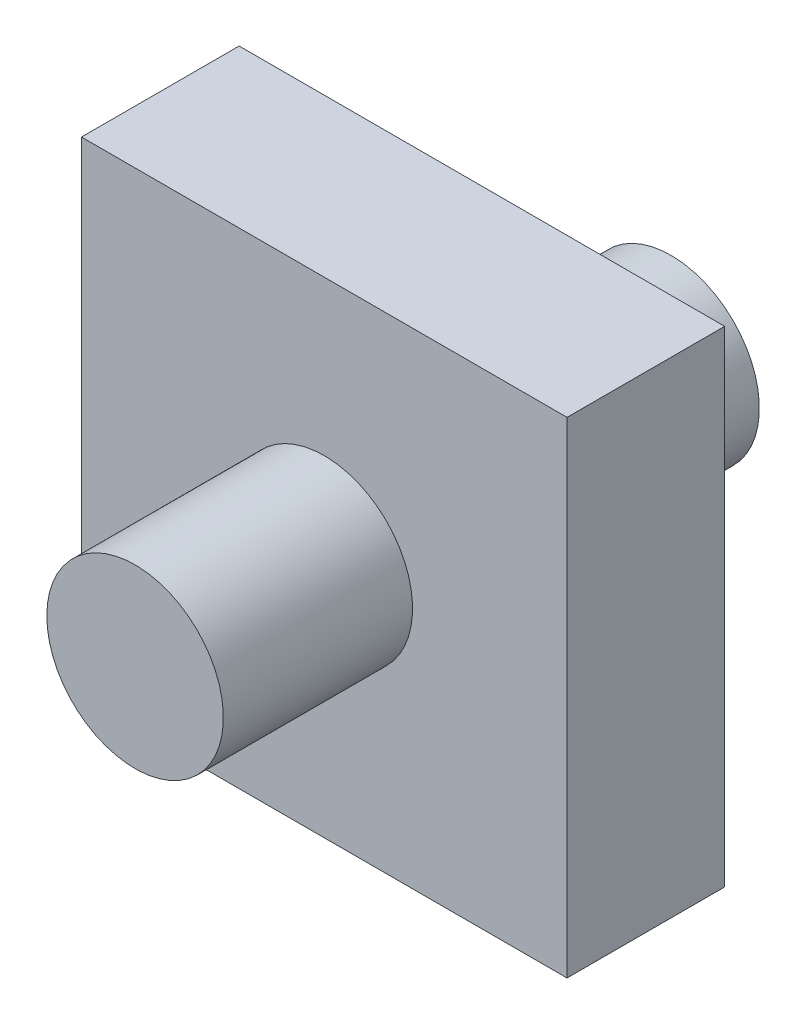
ISO-10303-21;
HEADER;
FILE_DESCRIPTION(('STEP AP214'),'2;1');
FILE_NAME('part.step','',(''),(''),'','','');
FILE_SCHEMA(('AUTOMOTIVE_DESIGN { 1 0 10303 214 1 1 1 1 }'));
ENDSEC;
DATA;
#1=APPLICATION_CONTEXT('core data for automotive mechanical design processes');
#2=APPLICATION_PROTOCOL_DEFINITION('international standard','automotive_design',2000,#1);
#3=PRODUCT_CONTEXT('',#1,'mechanical');
#4=PRODUCT('Part','Part','',(#3));
#5=PRODUCT_RELATED_PRODUCT_CATEGORY('part','',(#4));
#6=PRODUCT_DEFINITION_FORMATION('','',#4);
#7=PRODUCT_DEFINITION_CONTEXT('part definition',#1,'design');
#8=PRODUCT_DEFINITION('design','',#6,#7);
#9=PRODUCT_DEFINITION_SHAPE('','',#8);
#10=(LENGTH_UNIT() NAMED_UNIT(*) SI_UNIT(.MILLI.,.METRE.));
#11=(NAMED_UNIT(*) PLANE_ANGLE_UNIT() SI_UNIT($,.RADIAN.));
#12=(NAMED_UNIT(*) SI_UNIT($,.STERADIAN.) SOLID_ANGLE_UNIT());
#13=UNCERTAINTY_MEASURE_WITH_UNIT(LENGTH_MEASURE(1.E-05),#10,'distance_accuracy_value','');
#14=(GEOMETRIC_REPRESENTATION_CONTEXT(3) GLOBAL_UNCERTAINTY_ASSIGNED_CONTEXT((#13)) GLOBAL_UNIT_ASSIGNED_CONTEXT((#10,
#11,#12)) REPRESENTATION_CONTEXT('',''));
#15=CARTESIAN_POINT('',(0.,0.,0.));
#16=DIRECTION('',(0.,0.,1.));
#17=DIRECTION('',(1.,0.,0.));
#18=AXIS2_PLACEMENT_3D('',#15,#16,#17);
#19=CARTESIAN_POINT('',(3.85,-3.85,2.5));
#20=DIRECTION('',(-1.,0.,0.));
#21=DIRECTION('',(0.,-1.,0.));
#22=AXIS2_PLACEMENT_3D('',#19,#20,#21);
#23=PLANE('',#22);
#24=DIRECTION('',(0.,1.,0.));
#25=VECTOR('',#24,1.);
#26=CARTESIAN_POINT('',(3.85,-3.85,0.));
#27=LINE('',#26,#25);
#28=CARTESIAN_POINT('',(3.85,-3.85,0.));
#29=VERTEX_POINT('',#28);
#30=CARTESIAN_POINT('',(3.85,3.85,0.));
#31=VERTEX_POINT('',#30);
#32=EDGE_CURVE('E99',#29,#31,#27,.T.);
#33=ORIENTED_EDGE('',*,*,#32,.T.);
#34=DIRECTION('',(0.,0.,-1.));
#35=VECTOR('',#34,1.);
#36=CARTESIAN_POINT('',(3.85,3.85,2.5));
#37=LINE('',#36,#35);
#38=CARTESIAN_POINT('',(3.85,3.85,2.5));
#39=VERTEX_POINT('',#38);
#40=EDGE_CURVE('E36',#39,#31,#37,.T.);
#41=ORIENTED_EDGE('',*,*,#40,.F.);
#42=DIRECTION('',(0.,1.,0.));
#43=VECTOR('',#42,1.);
#44=CARTESIAN_POINT('',(3.85,-3.85,2.5));
#45=LINE('',#44,#43);
#46=CARTESIAN_POINT('',(3.85,-3.85,2.5));
#47=VERTEX_POINT('',#46);
#48=EDGE_CURVE('E86',#47,#39,#45,.T.);
#49=ORIENTED_EDGE('',*,*,#48,.F.);
#50=DIRECTION('',(0.,0.,-1.));
#51=VECTOR('',#50,1.);
#52=CARTESIAN_POINT('',(3.85,-3.85,2.5));
#53=LINE('',#52,#51);
#54=EDGE_CURVE('E95',#47,#29,#53,.T.);
#55=ORIENTED_EDGE('',*,*,#54,.T.);
#56=EDGE_LOOP('',(#33,#41,#49,#55));
#57=FACE_BOUND('',#56,.T.);
#58=ADVANCED_FACE('F33',(#57),#23,.F.);
#59=CARTESIAN_POINT('',(-3.85,3.85,2.5));
#60=DIRECTION('',(0.,-1.,0.));
#61=DIRECTION('',(0.,0.,-1.));
#62=AXIS2_PLACEMENT_3D('',#59,#60,#61);
#63=PLANE('',#62);
#64=DIRECTION('',(-1.,0.,0.));
#65=VECTOR('',#64,1.);
#66=CARTESIAN_POINT('',(-3.85,3.85,0.));
#67=LINE('',#66,#65);
#68=CARTESIAN_POINT('',(-3.85,3.85,0.));
#69=VERTEX_POINT('',#68);
#70=EDGE_CURVE('E91',#31,#69,#67,.T.);
#71=ORIENTED_EDGE('',*,*,#70,.T.);
#72=DIRECTION('',(0.,0.,-1.));
#73=VECTOR('',#72,1.);
#74=CARTESIAN_POINT('',(-3.85,3.85,2.5));
#75=LINE('',#74,#73);
#76=CARTESIAN_POINT('',(-3.85,3.85,2.5));
#77=VERTEX_POINT('',#76);
#78=EDGE_CURVE('E89',#77,#69,#75,.T.);
#79=ORIENTED_EDGE('',*,*,#78,.F.);
#80=DIRECTION('',(-1.,0.,0.));
#81=VECTOR('',#80,1.);
#82=CARTESIAN_POINT('',(-3.85,3.85,2.5));
#83=LINE('',#82,#81);
#84=EDGE_CURVE('E81',#39,#77,#83,.T.);
#85=ORIENTED_EDGE('',*,*,#84,.F.);
#86=ORIENTED_EDGE('',*,*,#40,.T.);
#87=EDGE_LOOP('',(#71,#79,#85,#86));
#88=FACE_BOUND('',#87,.T.);
#89=ADVANCED_FACE('F90',(#88),#63,.F.);
#90=CARTESIAN_POINT('',(-3.85,-3.85,2.5));
#91=DIRECTION('',(1.,0.,0.));
#92=DIRECTION('',(0.,0.,-1.));
#93=AXIS2_PLACEMENT_3D('',#90,#91,#92);
#94=PLANE('',#93);
#95=DIRECTION('',(0.,-1.,0.));
#96=VECTOR('',#95,1.);
#97=CARTESIAN_POINT('',(-3.85,-3.85,0.));
#98=LINE('',#97,#96);
#99=CARTESIAN_POINT('',(-3.85,-3.85,0.));
#100=VERTEX_POINT('',#99);
#101=EDGE_CURVE('E67',#69,#100,#98,.T.);
#102=ORIENTED_EDGE('',*,*,#101,.T.);
#103=DIRECTION('',(0.,0.,-1.));
#104=VECTOR('',#103,1.);
#105=CARTESIAN_POINT('',(-3.85,-3.85,2.5));
#106=LINE('',#105,#104);
#107=CARTESIAN_POINT('',(-3.85,-3.85,2.5));
#108=VERTEX_POINT('',#107);
#109=EDGE_CURVE('E92',#108,#100,#106,.T.);
#110=ORIENTED_EDGE('',*,*,#109,.F.);
#111=DIRECTION('',(0.,-1.,0.));
#112=VECTOR('',#111,1.);
#113=CARTESIAN_POINT('',(-3.85,-3.85,2.5));
#114=LINE('',#113,#112);
#115=EDGE_CURVE('E84',#77,#108,#114,.T.);
#116=ORIENTED_EDGE('',*,*,#115,.F.);
#117=ORIENTED_EDGE('',*,*,#78,.T.);
#118=EDGE_LOOP('',(#102,#110,#116,#117));
#119=FACE_BOUND('',#118,.T.);
#120=ADVANCED_FACE('F93',(#119),#94,.F.);
#121=CARTESIAN_POINT('',(-3.85,-3.85,2.5));
#122=DIRECTION('',(0.,1.,0.));
#123=DIRECTION('',(0.,0.,1.));
#124=AXIS2_PLACEMENT_3D('',#121,#122,#123);
#125=PLANE('',#124);
#126=DIRECTION('',(1.,0.,0.));
#127=VECTOR('',#126,1.);
#128=CARTESIAN_POINT('',(-3.85,-3.85,0.));
#129=LINE('',#128,#127);
#130=EDGE_CURVE('E73',#100,#29,#129,.T.);
#131=ORIENTED_EDGE('',*,*,#130,.T.);
#132=ORIENTED_EDGE('',*,*,#54,.F.);
#133=DIRECTION('',(1.,0.,0.));
#134=VECTOR('',#133,1.);
#135=CARTESIAN_POINT('',(-3.85,-3.85,2.5));
#136=LINE('',#135,#134);
#137=EDGE_CURVE('E50',#108,#47,#136,.T.);
#138=ORIENTED_EDGE('',*,*,#137,.F.);
#139=ORIENTED_EDGE('',*,*,#109,.T.);
#140=EDGE_LOOP('',(#131,#132,#138,#139));
#141=FACE_BOUND('',#140,.T.);
#142=ADVANCED_FACE('F107',(#141),#125,.F.);
#143=CARTESIAN_POINT('',(0.,0.,2.5));
#144=DIRECTION('',(0.,0.,-1.));
#145=DIRECTION('',(-1.,0.,0.));
#146=AXIS2_PLACEMENT_3D('',#143,#144,#145);
#147=PLANE('',#146);
#148=CARTESIAN_POINT('',(0.,0.,2.5));
#149=DIRECTION('',(0.,0.,-1.));
#150=DIRECTION('',(-1.,0.,0.));
#151=AXIS2_PLACEMENT_3D('',#148,#149,#150);
#152=CIRCLE('',#151,1.4);
#153=CARTESIAN_POINT('',(-1.4,0.,2.5));
#154=VERTEX_POINT('',#153);
#155=EDGE_CURVE('E122',#154,#154,#152,.T.);
#156=ORIENTED_EDGE('',*,*,#155,.T.);
#157=EDGE_LOOP('',(#156));
#158=FACE_BOUND('',#157,.T.);
#159=ORIENTED_EDGE('',*,*,#48,.T.);
#160=ORIENTED_EDGE('',*,*,#84,.T.);
#161=ORIENTED_EDGE('',*,*,#115,.T.);
#162=ORIENTED_EDGE('',*,*,#137,.T.);
#163=EDGE_LOOP('',(#159,#160,#161,#162));
#164=FACE_BOUND('',#163,.T.);
#165=ADVANCED_FACE('F82',(#158,#164),#147,.F.);
#166=CARTESIAN_POINT('',(0.,0.,0.));
#167=DIRECTION('',(0.,0.,-1.));
#168=DIRECTION('',(-1.,0.,0.));
#169=AXIS2_PLACEMENT_3D('',#166,#167,#168);
#170=PLANE('',#169);
#171=CARTESIAN_POINT('',(0.,0.,0.));
#172=DIRECTION('',(0.,0.,-1.));
#173=DIRECTION('',(-1.,0.,0.));
#174=AXIS2_PLACEMENT_3D('',#171,#172,#173);
#175=CIRCLE('',#174,1.4);
#176=CARTESIAN_POINT('',(-1.4,0.,0.));
#177=VERTEX_POINT('',#176);
#178=EDGE_CURVE('E11',#177,#177,#175,.T.);
#179=ORIENTED_EDGE('',*,*,#178,.F.);
#180=EDGE_LOOP('',(#179));
#181=FACE_BOUND('',#180,.T.);
#182=ORIENTED_EDGE('',*,*,#32,.F.);
#183=ORIENTED_EDGE('',*,*,#130,.F.);
#184=ORIENTED_EDGE('',*,*,#101,.F.);
#185=ORIENTED_EDGE('',*,*,#70,.F.);
#186=EDGE_LOOP('',(#182,#183,#184,#185));
#187=FACE_BOUND('',#186,.T.);
#188=ADVANCED_FACE('F110',(#181,#187),#170,.T.);
#189=CARTESIAN_POINT('',(0.,0.,-3.));
#190=DIRECTION('',(0.,0.,1.));
#191=DIRECTION('',(1.,0.,0.));
#192=AXIS2_PLACEMENT_3D('',#189,#190,#191);
#193=CYLINDRICAL_SURFACE('',#192,1.4);
#194=CARTESIAN_POINT('',(0.,0.,-3.));
#195=DIRECTION('',(0.,0.,-1.));
#196=DIRECTION('',(-1.,0.,0.));
#197=AXIS2_PLACEMENT_3D('',#194,#195,#196);
#198=CIRCLE('',#197,1.4);
#199=CARTESIAN_POINT('',(-1.4,0.,-3.));
#200=VERTEX_POINT('',#199);
#201=EDGE_CURVE('E102',#200,#200,#198,.T.);
#202=ORIENTED_EDGE('',*,*,#201,.F.);
#203=EDGE_LOOP('',(#202));
#204=FACE_BOUND('',#203,.T.);
#205=ORIENTED_EDGE('',*,*,#178,.T.);
#206=EDGE_LOOP('',(#205));
#207=FACE_BOUND('',#206,.T.);
#208=ADVANCED_FACE('F153',(#204,#207),#193,.T.);
#209=CARTESIAN_POINT('',(0.,0.,-3.));
#210=DIRECTION('',(0.,0.,-1.));
#211=DIRECTION('',(-1.,0.,0.));
#212=AXIS2_PLACEMENT_3D('',#209,#210,#211);
#213=PLANE('',#212);
#214=CARTESIAN_POINT('',(0.,0.,-3.));
#215=DIRECTION('',(0.,0.,-1.));
#216=DIRECTION('',(-1.,0.,0.));
#217=AXIS2_PLACEMENT_3D('',#214,#215,#216);
#218=CIRCLE('',#217,0.6);
#219=CARTESIAN_POINT('',(-0.6,0.,-3.));
#220=VERTEX_POINT('',#219);
#221=EDGE_CURVE('E116',#220,#220,#218,.T.);
#222=ORIENTED_EDGE('',*,*,#221,.F.);
#223=EDGE_LOOP('',(#222));
#224=FACE_BOUND('',#223,.T.);
#225=ORIENTED_EDGE('',*,*,#201,.T.);
#226=EDGE_LOOP('',(#225));
#227=FACE_BOUND('',#226,.T.);
#228=ADVANCED_FACE('F160',(#224,#227),#213,.T.);
#229=CARTESIAN_POINT('',(0.,0.,2.5));
#230=DIRECTION('',(0.,0.,-1.));
#231=DIRECTION('',(-1.,0.,0.));
#232=AXIS2_PLACEMENT_3D('',#229,#230,#231);
#233=CYLINDRICAL_SURFACE('',#232,0.6);
#234=CARTESIAN_POINT('',(0.,0.,2.5));
#235=DIRECTION('',(0.,0.,-1.));
#236=DIRECTION('',(-1.,0.,0.));
#237=AXIS2_PLACEMENT_3D('',#234,#235,#236);
#238=CIRCLE('',#237,0.6);
#239=CARTESIAN_POINT('',(-0.6,0.,2.5));
#240=VERTEX_POINT('',#239);
#241=EDGE_CURVE('E115',#240,#240,#238,.T.);
#242=ORIENTED_EDGE('',*,*,#241,.F.);
#243=EDGE_LOOP('',(#242));
#244=FACE_BOUND('',#243,.T.);
#245=ORIENTED_EDGE('',*,*,#221,.T.);
#246=EDGE_LOOP('',(#245));
#247=FACE_BOUND('',#246,.T.);
#248=ADVANCED_FACE('F164',(#244,#247),#233,.F.);
#249=CARTESIAN_POINT('',(0.,0.,2.5));
#250=DIRECTION('',(0.,0.,1.));
#251=DIRECTION('',(-1.,0.,0.));
#252=AXIS2_PLACEMENT_3D('',#249,#250,#251);
#253=PLANE('',#252);
#254=ORIENTED_EDGE('',*,*,#241,.T.);
#255=EDGE_LOOP('',(#254));
#256=FACE_BOUND('',#255,.T.);
#257=ADVANCED_FACE('F137',(#256),#253,.F.);
#258=CARTESIAN_POINT('',(0.,0.,5.5));
#259=DIRECTION('',(0.,0.,-1.));
#260=DIRECTION('',(-1.,0.,0.));
#261=AXIS2_PLACEMENT_3D('',#258,#259,#260);
#262=CYLINDRICAL_SURFACE('',#261,1.4);
#263=CARTESIAN_POINT('',(0.,0.,5.5));
#264=DIRECTION('',(0.,0.,-1.));
#265=DIRECTION('',(-1.,0.,0.));
#266=AXIS2_PLACEMENT_3D('',#263,#264,#265);
#267=CIRCLE('',#266,1.4);
#268=CARTESIAN_POINT('',(-1.4,0.,5.5));
#269=VERTEX_POINT('',#268);
#270=EDGE_CURVE('E119',#269,#269,#267,.T.);
#271=ORIENTED_EDGE('',*,*,#270,.T.);
#272=EDGE_LOOP('',(#271));
#273=FACE_BOUND('',#272,.T.);
#274=ORIENTED_EDGE('',*,*,#155,.F.);
#275=EDGE_LOOP('',(#274));
#276=FACE_BOUND('',#275,.T.);
#277=ADVANCED_FACE('F128',(#273,#276),#262,.T.);
#278=CARTESIAN_POINT('',(0.,0.,5.5));
#279=DIRECTION('',(0.,0.,1.));
#280=DIRECTION('',(-1.,0.,0.));
#281=AXIS2_PLACEMENT_3D('',#278,#279,#280);
#282=PLANE('',#281);
#283=ORIENTED_EDGE('',*,*,#270,.F.);
#284=EDGE_LOOP('',(#283));
#285=FACE_BOUND('',#284,.T.);
#286=ADVANCED_FACE('F131',(#285),#282,.T.);
#287=CLOSED_SHELL('',(#58,#89,#120,#142,#165,#188,#208,#228,#248,#257,#277,#286));
#288=MANIFOLD_SOLID_BREP('B2',#287);
#289=ADVANCED_BREP_SHAPE_REPRESENTATION('',(#18,#288),#14);
#290=SHAPE_DEFINITION_REPRESENTATION(#9,#289);
ENDSEC;
END-ISO-10303-21;
